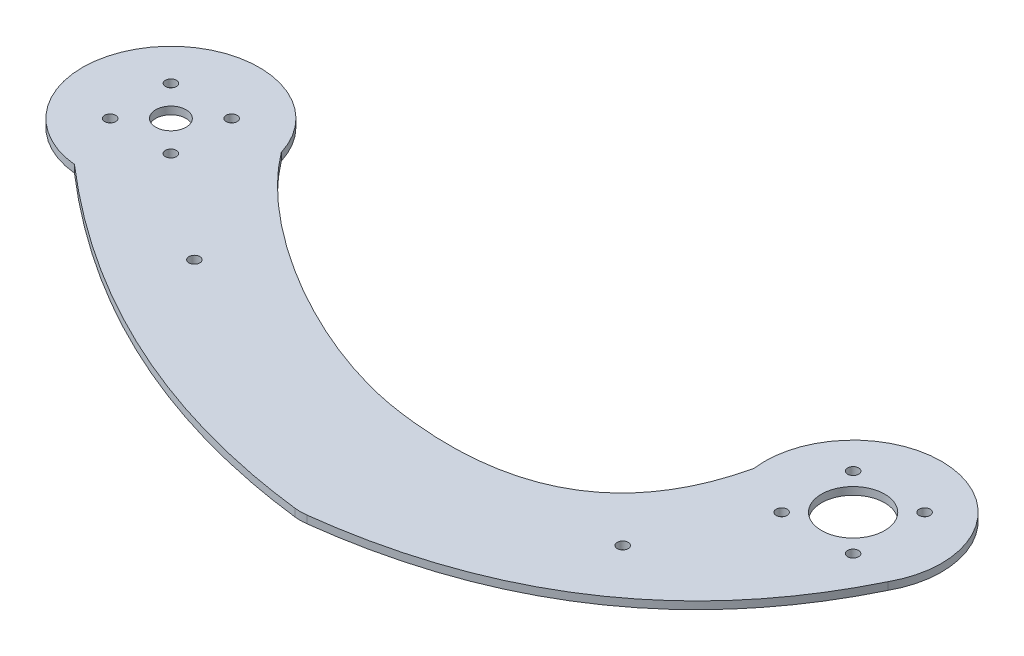
ISO-10303-21;
HEADER;
FILE_DESCRIPTION(('STEP AP214'),'2;1');
FILE_NAME('part.step','',(''),(''),'','','');
FILE_SCHEMA(('AUTOMOTIVE_DESIGN { 1 0 10303 214 1 1 1 1 }'));
ENDSEC;
DATA;
#1=APPLICATION_CONTEXT('core data for automotive mechanical design processes');
#2=APPLICATION_PROTOCOL_DEFINITION('international standard','automotive_design',2000,#1);
#3=PRODUCT_CONTEXT('',#1,'mechanical');
#4=PRODUCT('Part','Part','',(#3));
#5=PRODUCT_RELATED_PRODUCT_CATEGORY('part','',(#4));
#6=PRODUCT_DEFINITION_FORMATION('','',#4);
#7=PRODUCT_DEFINITION_CONTEXT('part definition',#1,'design');
#8=PRODUCT_DEFINITION('design','',#6,#7);
#9=PRODUCT_DEFINITION_SHAPE('','',#8);
#10=(LENGTH_UNIT() NAMED_UNIT(*) SI_UNIT(.MILLI.,.METRE.));
#11=(NAMED_UNIT(*) PLANE_ANGLE_UNIT() SI_UNIT($,.RADIAN.));
#12=(NAMED_UNIT(*) SI_UNIT($,.STERADIAN.) SOLID_ANGLE_UNIT());
#13=UNCERTAINTY_MEASURE_WITH_UNIT(LENGTH_MEASURE(1.E-05),#10,'distance_accuracy_value','');
#14=(GEOMETRIC_REPRESENTATION_CONTEXT(3) GLOBAL_UNCERTAINTY_ASSIGNED_CONTEXT((#13)) GLOBAL_UNIT_ASSIGNED_CONTEXT((#10,
#11,#12)) REPRESENTATION_CONTEXT('',''));
#15=CARTESIAN_POINT('',(0.,0.,0.));
#16=DIRECTION('',(0.,0.,1.));
#17=DIRECTION('',(1.,0.,0.));
#18=AXIS2_PLACEMENT_3D('',#15,#16,#17);
#19=CARTESIAN_POINT('',(-118.261066558205,1.5,-5.10471421640356));
#20=CARTESIAN_POINT('',(-107.655217460024,1.5,9.02423040156873));
#21=CARTESIAN_POINT('',(-84.0425144989486,1.5,23.6719178940767));
#22=CARTESIAN_POINT('',(-64.3720793477385,1.5,27.2877139284286));
#23=B_SPLINE_CURVE_WITH_KNOTS('',3,(#19,#20,#21,#22),.UNSPECIFIED.,.F.,.F.,(4,4),(0.,1.),.UNSPECIFIED.);
#24=DIRECTION('',(0.,-1.,0.));
#25=VECTOR('',#24,1.);
#26=SURFACE_OF_LINEAR_EXTRUSION('',#23,#25);
#27=CARTESIAN_POINT('',(-118.261066558205,0.,-5.10471421640356));
#28=CARTESIAN_POINT('',(-107.655217460024,0.,9.02423040156873));
#29=CARTESIAN_POINT('',(-84.0425144989486,0.,23.6719178940767));
#30=CARTESIAN_POINT('',(-64.3720793477385,0.,27.2877139284286));
#31=B_SPLINE_CURVE_WITH_KNOTS('',3,(#27,#28,#29,#30),.UNSPECIFIED.,.F.,.F.,(4,4),(0.,1.),.UNSPECIFIED.);
#32=CARTESIAN_POINT('',(-118.261066558205,0.,-5.10471421640356));
#33=VERTEX_POINT('',#32);
#34=CARTESIAN_POINT('',(-64.3720793477385,0.,27.2877139284286));
#35=VERTEX_POINT('',#34);
#36=EDGE_CURVE('E101',#33,#35,#31,.T.);
#37=ORIENTED_EDGE('',*,*,#36,.F.);
#38=DIRECTION('',(0.,-1.,0.));
#39=VECTOR('',#38,1.);
#40=CARTESIAN_POINT('',(-118.261066558205,1.5,-5.10471421640356));
#41=LINE('',#40,#39);
#42=CARTESIAN_POINT('',(-118.261066558205,1.5,-5.10471421640356));
#43=VERTEX_POINT('',#42);
#44=EDGE_CURVE('E96',#43,#33,#41,.T.);
#45=ORIENTED_EDGE('',*,*,#44,.F.);
#46=CARTESIAN_POINT('',(-64.3720793477385,1.5,27.2877139284286));
#47=VERTEX_POINT('',#46);
#48=EDGE_CURVE('E99',#43,#47,#23,.T.);
#49=ORIENTED_EDGE('',*,*,#48,.T.);
#50=DIRECTION('',(0.,-1.,0.));
#51=VECTOR('',#50,1.);
#52=CARTESIAN_POINT('',(-64.3720793477385,1.5,27.2877139284286));
#53=LINE('',#52,#51);
#54=EDGE_CURVE('E203',#47,#35,#53,.T.);
#55=ORIENTED_EDGE('',*,*,#54,.T.);
#56=EDGE_LOOP('',(#37,#45,#49,#55));
#57=FACE_BOUND('',#56,.T.);
#58=ADVANCED_FACE('F35',(#57),#26,.T.);
#59=CARTESIAN_POINT('',(-135.,1.5,0.));
#60=DIRECTION('',(0.,-1.,0.));
#61=DIRECTION('',(0.,0.,-1.));
#62=AXIS2_PLACEMENT_3D('',#59,#60,#61);
#63=CYLINDRICAL_SURFACE('',#62,17.5);
#64=CARTESIAN_POINT('',(-135.,0.,0.));
#65=DIRECTION('',(0.,1.,0.));
#66=DIRECTION('',(0.,0.,1.));
#67=AXIS2_PLACEMENT_3D('',#64,#65,#66);
#68=CIRCLE('',#67,17.5);
#69=CARTESIAN_POINT('',(-136.664707238582,0.,17.4206414867482));
#70=VERTEX_POINT('',#69);
#71=EDGE_CURVE('E252',#33,#70,#68,.T.);
#72=ORIENTED_EDGE('',*,*,#71,.T.);
#73=DIRECTION('',(0.,-1.,0.));
#74=VECTOR('',#73,1.);
#75=CARTESIAN_POINT('',(-136.664707238582,1.5,17.4206414867482));
#76=LINE('',#75,#74);
#77=CARTESIAN_POINT('',(-136.664707238582,1.5,17.4206414867482));
#78=VERTEX_POINT('',#77);
#79=EDGE_CURVE('E105',#78,#70,#76,.T.);
#80=ORIENTED_EDGE('',*,*,#79,.F.);
#81=CARTESIAN_POINT('',(-135.,1.5,0.));
#82=DIRECTION('',(0.,1.,0.));
#83=DIRECTION('',(0.,0.,1.));
#84=AXIS2_PLACEMENT_3D('',#81,#82,#83);
#85=CIRCLE('',#84,17.5);
#86=EDGE_CURVE('E108',#43,#78,#85,.T.);
#87=ORIENTED_EDGE('',*,*,#86,.F.);
#88=ORIENTED_EDGE('',*,*,#44,.T.);
#89=EDGE_LOOP('',(#72,#80,#87,#88));
#90=FACE_BOUND('',#89,.T.);
#91=ADVANCED_FACE('F109',(#90),#63,.T.);
#92=CARTESIAN_POINT('',(-136.664707238582,1.5,17.4206414867482));
#93=CARTESIAN_POINT('',(-99.4930209229655,1.5,49.665084924322));
#94=CARTESIAN_POINT('',(-54.7701998799787,1.5,54.651995586945));
#95=B_SPLINE_CURVE_WITH_KNOTS('',2,(#92,#93,#94),.UNSPECIFIED.,.F.,.F.,(3,3),(0.,1.),.UNSPECIFIED.);
#96=DIRECTION('',(0.,-1.,0.));
#97=VECTOR('',#96,1.);
#98=SURFACE_OF_LINEAR_EXTRUSION('',#95,#97);
#99=CARTESIAN_POINT('',(-136.664707238582,0.,17.4206414867482));
#100=CARTESIAN_POINT('',(-99.4930209229655,0.,49.665084924322));
#101=CARTESIAN_POINT('',(-54.7701998799787,0.,54.651995586945));
#102=B_SPLINE_CURVE_WITH_KNOTS('',2,(#99,#100,#101),.UNSPECIFIED.,.F.,.F.,(3,3),(0.,1.),.UNSPECIFIED.);
#103=CARTESIAN_POINT('',(-55.9740190021661,0.,54.5126598167099));
#104=VERTEX_POINT('',#103);
#105=EDGE_CURVE('E372',#70,#104,#102,.T.);
#106=ORIENTED_EDGE('',*,*,#105,.T.);
#107=DIRECTION('',(0.,-1.,0.));
#108=VECTOR('',#107,1.);
#109=CARTESIAN_POINT('',(-55.9740190021661,0.,54.5126598167099));
#110=LINE('',#109,#108);
#111=CARTESIAN_POINT('',(-55.9740190021661,1.5,54.5126598167099));
#112=VERTEX_POINT('',#111);
#113=EDGE_CURVE('E44',#104,#112,#110,.F.);
#114=ORIENTED_EDGE('',*,*,#113,.T.);
#115=EDGE_CURVE('E112',#78,#112,#95,.T.);
#116=ORIENTED_EDGE('',*,*,#115,.F.);
#117=ORIENTED_EDGE('',*,*,#79,.T.);
#118=EDGE_LOOP('',(#106,#114,#116,#117));
#119=FACE_BOUND('',#118,.T.);
#120=ADVANCED_FACE('F138',(#119),#98,.F.);
#121=CARTESIAN_POINT('',(15.3309677425393,1.5,8.43868639524062));
#122=CARTESIAN_POINT('',(-4.32865670175105,1.5,48.9170653982276));
#123=CARTESIAN_POINT('',(-54.7701998799787,1.5,54.651995586945));
#124=B_SPLINE_CURVE_WITH_KNOTS('',2,(#121,#122,#123),.UNSPECIFIED.,.F.,.F.,(3,3),(0.,1.),.UNSPECIFIED.);
#125=DIRECTION('',(0.,-1.,0.));
#126=VECTOR('',#125,1.);
#127=SURFACE_OF_LINEAR_EXTRUSION('',#124,#126);
#128=CARTESIAN_POINT('',(15.3309677425393,1.5,8.43868639524061));
#129=VERTEX_POINT('',#128);
#130=CARTESIAN_POINT('',(-53.5631487986116,1.5,54.509245270254));
#131=VERTEX_POINT('',#130);
#132=EDGE_CURVE('E147',#129,#131,#124,.T.);
#133=ORIENTED_EDGE('',*,*,#132,.T.);
#134=DIRECTION('',(0.,-1.,0.));
#135=VECTOR('',#134,1.);
#136=CARTESIAN_POINT('',(-53.5631487986116,1.5,54.509245270254));
#137=LINE('',#136,#135);
#138=CARTESIAN_POINT('',(-53.5631487986116,0.,54.509245270254));
#139=VERTEX_POINT('',#138);
#140=EDGE_CURVE('E104',#131,#139,#137,.T.);
#141=ORIENTED_EDGE('',*,*,#140,.T.);
#142=CARTESIAN_POINT('',(15.3309677425393,0.,8.43868639524062));
#143=CARTESIAN_POINT('',(-4.32865670175105,0.,48.9170653982276));
#144=CARTESIAN_POINT('',(-54.7701998799787,0.,54.651995586945));
#145=B_SPLINE_CURVE_WITH_KNOTS('',2,(#142,#143,#144),.UNSPECIFIED.,.F.,.F.,(3,3),(0.,1.),.UNSPECIFIED.);
#146=CARTESIAN_POINT('',(15.3309677425393,0.,8.43868639524061));
#147=VERTEX_POINT('',#146);
#148=EDGE_CURVE('E200',#147,#139,#145,.T.);
#149=ORIENTED_EDGE('',*,*,#148,.F.);
#150=DIRECTION('',(0.,-1.,0.));
#151=VECTOR('',#150,1.);
#152=CARTESIAN_POINT('',(15.3309677425393,1.5,8.43868639524061));
#153=LINE('',#152,#151);
#154=EDGE_CURVE('E196',#129,#147,#153,.T.);
#155=ORIENTED_EDGE('',*,*,#154,.F.);
#156=EDGE_LOOP('',(#133,#141,#149,#155));
#157=FACE_BOUND('',#156,.T.);
#158=ADVANCED_FACE('F141',(#157),#127,.T.);
#159=CARTESIAN_POINT('',(0.,1.5,0.));
#160=DIRECTION('',(0.,-1.,0.));
#161=DIRECTION('',(0.,0.,-1.));
#162=AXIS2_PLACEMENT_3D('',#159,#160,#161);
#163=CYLINDRICAL_SURFACE('',#162,17.5);
#164=CARTESIAN_POINT('',(0.,0.,0.));
#165=DIRECTION('',(0.,1.,0.));
#166=DIRECTION('',(0.,0.,1.));
#167=AXIS2_PLACEMENT_3D('',#164,#165,#166);
#168=CIRCLE('',#167,17.5);
#169=CARTESIAN_POINT('',(-17.3457531586902,0.,2.3183717039741));
#170=VERTEX_POINT('',#169);
#171=EDGE_CURVE('E192',#147,#170,#168,.T.);
#172=ORIENTED_EDGE('',*,*,#171,.T.);
#173=DIRECTION('',(0.,-1.,0.));
#174=VECTOR('',#173,1.);
#175=CARTESIAN_POINT('',(-17.3457531586902,1.5,2.3183717039741));
#176=LINE('',#175,#174);
#177=CARTESIAN_POINT('',(-17.3457531586902,1.5,2.3183717039741));
#178=VERTEX_POINT('',#177);
#179=EDGE_CURVE('E195',#178,#170,#176,.T.);
#180=ORIENTED_EDGE('',*,*,#179,.F.);
#181=CARTESIAN_POINT('',(0.,1.5,0.));
#182=DIRECTION('',(0.,1.,0.));
#183=DIRECTION('',(0.,0.,1.));
#184=AXIS2_PLACEMENT_3D('',#181,#182,#183);
#185=CIRCLE('',#184,17.5);
#186=EDGE_CURVE('E156',#129,#178,#185,.T.);
#187=ORIENTED_EDGE('',*,*,#186,.F.);
#188=ORIENTED_EDGE('',*,*,#154,.T.);
#189=EDGE_LOOP('',(#172,#180,#187,#188));
#190=FACE_BOUND('',#189,.T.);
#191=ADVANCED_FACE('F178',(#190),#163,.T.);
#192=CARTESIAN_POINT('',(-141.010407640085,1.5,6.01040764008586));
#193=DIRECTION('',(0.,-1.,0.));
#194=DIRECTION('',(0.,0.,-1.));
#195=AXIS2_PLACEMENT_3D('',#192,#193,#194);
#196=CYLINDRICAL_SURFACE('',#195,1.09000000000001);
#197=CARTESIAN_POINT('',(-141.010407640085,1.5,6.01040764008586));
#198=DIRECTION('',(0.,1.,0.));
#199=DIRECTION('',(0.,0.,1.));
#200=AXIS2_PLACEMENT_3D('',#197,#198,#199);
#201=CIRCLE('',#200,1.09000000000001);
#202=CARTESIAN_POINT('',(-141.010407640085,1.5,7.10040764008587));
#203=VERTEX_POINT('',#202);
#204=EDGE_CURVE('E361',#203,#203,#201,.T.);
#205=ORIENTED_EDGE('',*,*,#204,.T.);
#206=EDGE_LOOP('',(#205));
#207=FACE_BOUND('',#206,.T.);
#208=CARTESIAN_POINT('',(-141.010407640085,0.,6.01040764008586));
#209=DIRECTION('',(0.,1.,0.));
#210=DIRECTION('',(0.,0.,1.));
#211=AXIS2_PLACEMENT_3D('',#208,#209,#210);
#212=CIRCLE('',#211,1.09000000000001);
#213=CARTESIAN_POINT('',(-141.010407640085,0.,7.10040764008587));
#214=VERTEX_POINT('',#213);
#215=EDGE_CURVE('E122',#214,#214,#212,.T.);
#216=ORIENTED_EDGE('',*,*,#215,.F.);
#217=EDGE_LOOP('',(#216));
#218=FACE_BOUND('',#217,.T.);
#219=ADVANCED_FACE('F180',(#207,#218),#196,.F.);
#220=CARTESIAN_POINT('',(-128.989592359914,1.5,6.01040764008565));
#221=DIRECTION('',(0.,-1.,0.));
#222=DIRECTION('',(0.,0.,-1.));
#223=AXIS2_PLACEMENT_3D('',#220,#221,#222);
#224=CYLINDRICAL_SURFACE('',#223,1.09000000000001);
#225=CARTESIAN_POINT('',(-128.989592359914,1.5,6.01040764008565));
#226=DIRECTION('',(0.,1.,0.));
#227=DIRECTION('',(0.,0.,1.));
#228=AXIS2_PLACEMENT_3D('',#225,#226,#227);
#229=CIRCLE('',#228,1.09000000000001);
#230=CARTESIAN_POINT('',(-128.989592359914,1.5,7.10040764008566));
#231=VERTEX_POINT('',#230);
#232=EDGE_CURVE('E358',#231,#231,#229,.T.);
#233=ORIENTED_EDGE('',*,*,#232,.T.);
#234=EDGE_LOOP('',(#233));
#235=FACE_BOUND('',#234,.T.);
#236=CARTESIAN_POINT('',(-128.989592359914,0.,6.01040764008565));
#237=DIRECTION('',(0.,1.,0.));
#238=DIRECTION('',(0.,0.,1.));
#239=AXIS2_PLACEMENT_3D('',#236,#237,#238);
#240=CIRCLE('',#239,1.09000000000001);
#241=CARTESIAN_POINT('',(-128.989592359914,0.,7.10040764008566));
#242=VERTEX_POINT('',#241);
#243=EDGE_CURVE('E236',#242,#242,#240,.T.);
#244=ORIENTED_EDGE('',*,*,#243,.F.);
#245=EDGE_LOOP('',(#244));
#246=FACE_BOUND('',#245,.T.);
#247=ADVANCED_FACE('F186',(#235,#246),#224,.F.);
#248=CARTESIAN_POINT('',(-128.989592359914,1.5,-6.01040764008566));
#249=DIRECTION('',(0.,-1.,0.));
#250=DIRECTION('',(0.,0.,-1.));
#251=AXIS2_PLACEMENT_3D('',#248,#249,#250);
#252=CYLINDRICAL_SURFACE('',#251,1.09000000000001);
#253=CARTESIAN_POINT('',(-128.989592359914,1.5,-6.01040764008566));
#254=DIRECTION('',(0.,1.,0.));
#255=DIRECTION('',(0.,0.,1.));
#256=AXIS2_PLACEMENT_3D('',#253,#254,#255);
#257=CIRCLE('',#256,1.09000000000001);
#258=CARTESIAN_POINT('',(-128.989592359914,1.5,-4.92040764008565));
#259=VERTEX_POINT('',#258);
#260=EDGE_CURVE('E355',#259,#259,#257,.T.);
#261=ORIENTED_EDGE('',*,*,#260,.T.);
#262=EDGE_LOOP('',(#261));
#263=FACE_BOUND('',#262,.T.);
#264=CARTESIAN_POINT('',(-128.989592359914,0.,-6.01040764008566));
#265=DIRECTION('',(0.,1.,0.));
#266=DIRECTION('',(0.,0.,1.));
#267=AXIS2_PLACEMENT_3D('',#264,#265,#266);
#268=CIRCLE('',#267,1.09000000000001);
#269=CARTESIAN_POINT('',(-128.989592359914,0.,-4.92040764008565));
#270=VERTEX_POINT('',#269);
#271=EDGE_CURVE('E233',#270,#270,#268,.T.);
#272=ORIENTED_EDGE('',*,*,#271,.F.);
#273=EDGE_LOOP('',(#272));
#274=FACE_BOUND('',#273,.T.);
#275=ADVANCED_FACE('F283',(#263,#274),#252,.F.);
#276=CARTESIAN_POINT('',(-7.07106781186506,1.5,7.07106781186553));
#277=DIRECTION('',(0.,-1.,0.));
#278=DIRECTION('',(0.,0.,-1.));
#279=AXIS2_PLACEMENT_3D('',#276,#277,#278);
#280=CYLINDRICAL_SURFACE('',#279,1.08999999999994);
#281=CARTESIAN_POINT('',(-7.07106781186506,1.5,7.07106781186553));
#282=DIRECTION('',(0.,1.,0.));
#283=DIRECTION('',(0.,0.,1.));
#284=AXIS2_PLACEMENT_3D('',#281,#282,#283);
#285=CIRCLE('',#284,1.08999999999994);
#286=CARTESIAN_POINT('',(-7.07106781186506,1.5,8.16106781186548));
#287=VERTEX_POINT('',#286);
#288=EDGE_CURVE('E352',#287,#287,#285,.T.);
#289=ORIENTED_EDGE('',*,*,#288,.T.);
#290=EDGE_LOOP('',(#289));
#291=FACE_BOUND('',#290,.T.);
#292=CARTESIAN_POINT('',(-7.07106781186506,0.,7.07106781186553));
#293=DIRECTION('',(0.,1.,0.));
#294=DIRECTION('',(0.,0.,1.));
#295=AXIS2_PLACEMENT_3D('',#292,#293,#294);
#296=CIRCLE('',#295,1.08999999999994);
#297=CARTESIAN_POINT('',(-7.07106781186506,0.,8.16106781186548));
#298=VERTEX_POINT('',#297);
#299=EDGE_CURVE('E230',#298,#298,#296,.T.);
#300=ORIENTED_EDGE('',*,*,#299,.F.);
#301=EDGE_LOOP('',(#300));
#302=FACE_BOUND('',#301,.T.);
#303=ADVANCED_FACE('F287',(#291,#302),#280,.F.);
#304=CARTESIAN_POINT('',(7.07106781186594,1.5,7.07106781186507));
#305=DIRECTION('',(0.,-1.,0.));
#306=DIRECTION('',(0.,0.,-1.));
#307=AXIS2_PLACEMENT_3D('',#304,#305,#306);
#308=CYLINDRICAL_SURFACE('',#307,1.08999999999994);
#309=CARTESIAN_POINT('',(7.07106781186594,1.5,7.07106781186507));
#310=DIRECTION('',(0.,1.,0.));
#311=DIRECTION('',(0.,0.,1.));
#312=AXIS2_PLACEMENT_3D('',#309,#310,#311);
#313=CIRCLE('',#312,1.08999999999994);
#314=CARTESIAN_POINT('',(7.07106781186594,1.5,8.16106781186501));
#315=VERTEX_POINT('',#314);
#316=EDGE_CURVE('E349',#315,#315,#313,.T.);
#317=ORIENTED_EDGE('',*,*,#316,.T.);
#318=EDGE_LOOP('',(#317));
#319=FACE_BOUND('',#318,.T.);
#320=CARTESIAN_POINT('',(7.07106781186594,0.,7.07106781186507));
#321=DIRECTION('',(0.,1.,0.));
#322=DIRECTION('',(0.,0.,1.));
#323=AXIS2_PLACEMENT_3D('',#320,#321,#322);
#324=CIRCLE('',#323,1.08999999999994);
#325=CARTESIAN_POINT('',(7.07106781186594,0.,8.16106781186501));
#326=VERTEX_POINT('',#325);
#327=EDGE_CURVE('E227',#326,#326,#324,.T.);
#328=ORIENTED_EDGE('',*,*,#327,.F.);
#329=EDGE_LOOP('',(#328));
#330=FACE_BOUND('',#329,.T.);
#331=ADVANCED_FACE('F291',(#319,#330),#308,.F.);
#332=CARTESIAN_POINT('',(7.07106781186548,1.5,-7.07106781186592));
#333=DIRECTION('',(0.,-1.,0.));
#334=DIRECTION('',(0.,0.,-1.));
#335=AXIS2_PLACEMENT_3D('',#332,#333,#334);
#336=CYLINDRICAL_SURFACE('',#335,1.08999999999994);
#337=CARTESIAN_POINT('',(7.07106781186548,1.5,-7.07106781186592));
#338=DIRECTION('',(0.,1.,0.));
#339=DIRECTION('',(0.,0.,1.));
#340=AXIS2_PLACEMENT_3D('',#337,#338,#339);
#341=CIRCLE('',#340,1.08999999999994);
#342=CARTESIAN_POINT('',(7.07106781186548,1.5,-5.98106781186598));
#343=VERTEX_POINT('',#342);
#344=EDGE_CURVE('E343',#343,#343,#341,.T.);
#345=ORIENTED_EDGE('',*,*,#344,.T.);
#346=EDGE_LOOP('',(#345));
#347=FACE_BOUND('',#346,.T.);
#348=CARTESIAN_POINT('',(7.07106781186548,0.,-7.07106781186592));
#349=DIRECTION('',(0.,1.,0.));
#350=DIRECTION('',(0.,0.,1.));
#351=AXIS2_PLACEMENT_3D('',#348,#349,#350);
#352=CIRCLE('',#351,1.08999999999994);
#353=CARTESIAN_POINT('',(7.07106781186548,0.,-5.98106781186598));
#354=VERTEX_POINT('',#353);
#355=EDGE_CURVE('E224',#354,#354,#352,.T.);
#356=ORIENTED_EDGE('',*,*,#355,.F.);
#357=EDGE_LOOP('',(#356));
#358=FACE_BOUND('',#357,.T.);
#359=ADVANCED_FACE('F295',(#347,#358),#336,.F.);
#360=CARTESIAN_POINT('',(-135.,1.5,0.));
#361=DIRECTION('',(0.,-1.,0.));
#362=DIRECTION('',(0.,0.,-1.));
#363=AXIS2_PLACEMENT_3D('',#360,#361,#362);
#364=CYLINDRICAL_SURFACE('',#363,2.99999999999999);
#365=CARTESIAN_POINT('',(-135.,1.5,0.));
#366=DIRECTION('',(0.,1.,0.));
#367=DIRECTION('',(0.,0.,1.));
#368=AXIS2_PLACEMENT_3D('',#365,#366,#367);
#369=CIRCLE('',#368,2.99999999999999);
#370=CARTESIAN_POINT('',(-135.,1.5,2.99999999999999));
#371=VERTEX_POINT('',#370);
#372=EDGE_CURVE('E341',#371,#371,#369,.T.);
#373=ORIENTED_EDGE('',*,*,#372,.T.);
#374=EDGE_LOOP('',(#373));
#375=FACE_BOUND('',#374,.T.);
#376=CARTESIAN_POINT('',(-135.,0.,0.));
#377=DIRECTION('',(0.,1.,0.));
#378=DIRECTION('',(0.,0.,1.));
#379=AXIS2_PLACEMENT_3D('',#376,#377,#378);
#380=CIRCLE('',#379,2.99999999999999);
#381=CARTESIAN_POINT('',(-135.,0.,2.99999999999999));
#382=VERTEX_POINT('',#381);
#383=EDGE_CURVE('E221',#382,#382,#380,.T.);
#384=ORIENTED_EDGE('',*,*,#383,.F.);
#385=EDGE_LOOP('',(#384));
#386=FACE_BOUND('',#385,.T.);
#387=ADVANCED_FACE('F299',(#375,#386),#364,.F.);
#388=CARTESIAN_POINT('',(-7.07106781186552,1.5,-7.07106781186546));
#389=DIRECTION('',(0.,-1.,0.));
#390=DIRECTION('',(0.,0.,-1.));
#391=AXIS2_PLACEMENT_3D('',#388,#389,#390);
#392=CYLINDRICAL_SURFACE('',#391,1.08999999999994);
#393=CARTESIAN_POINT('',(-7.07106781186552,1.5,-7.07106781186546));
#394=DIRECTION('',(0.,1.,0.));
#395=DIRECTION('',(0.,0.,1.));
#396=AXIS2_PLACEMENT_3D('',#393,#394,#395);
#397=CIRCLE('',#396,1.08999999999994);
#398=CARTESIAN_POINT('',(-7.07106781186552,1.5,-5.98106781186552));
#399=VERTEX_POINT('',#398);
#400=EDGE_CURVE('E313',#399,#399,#397,.T.);
#401=ORIENTED_EDGE('',*,*,#400,.T.);
#402=EDGE_LOOP('',(#401));
#403=FACE_BOUND('',#402,.T.);
#404=CARTESIAN_POINT('',(-7.07106781186552,0.,-7.07106781186546));
#405=DIRECTION('',(0.,1.,0.));
#406=DIRECTION('',(0.,0.,1.));
#407=AXIS2_PLACEMENT_3D('',#404,#405,#406);
#408=CIRCLE('',#407,1.08999999999994);
#409=CARTESIAN_POINT('',(-7.07106781186552,0.,-5.98106781186552));
#410=VERTEX_POINT('',#409);
#411=EDGE_CURVE('E210',#410,#410,#408,.T.);
#412=ORIENTED_EDGE('',*,*,#411,.F.);
#413=EDGE_LOOP('',(#412));
#414=FACE_BOUND('',#413,.T.);
#415=ADVANCED_FACE('F302',(#403,#414),#392,.F.);
#416=CARTESIAN_POINT('',(0.,1.5,0.));
#417=DIRECTION('',(0.,-1.,0.));
#418=DIRECTION('',(0.,0.,-1.));
#419=AXIS2_PLACEMENT_3D('',#416,#417,#418);
#420=CYLINDRICAL_SURFACE('',#419,6.25);
#421=CARTESIAN_POINT('',(0.,1.5,0.));
#422=DIRECTION('',(0.,1.,0.));
#423=DIRECTION('',(0.,0.,1.));
#424=AXIS2_PLACEMENT_3D('',#421,#422,#423);
#425=CIRCLE('',#424,6.25);
#426=CARTESIAN_POINT('',(0.,1.5,6.25));
#427=VERTEX_POINT('',#426);
#428=EDGE_CURVE('E165',#427,#427,#425,.T.);
#429=ORIENTED_EDGE('',*,*,#428,.T.);
#430=EDGE_LOOP('',(#429));
#431=FACE_BOUND('',#430,.T.);
#432=CARTESIAN_POINT('',(0.,0.,0.));
#433=DIRECTION('',(0.,1.,0.));
#434=DIRECTION('',(0.,0.,1.));
#435=AXIS2_PLACEMENT_3D('',#432,#433,#434);
#436=CIRCLE('',#435,6.25);
#437=CARTESIAN_POINT('',(0.,0.,6.25));
#438=VERTEX_POINT('',#437);
#439=EDGE_CURVE('E207',#438,#438,#436,.T.);
#440=ORIENTED_EDGE('',*,*,#439,.F.);
#441=EDGE_LOOP('',(#440));
#442=FACE_BOUND('',#441,.T.);
#443=ADVANCED_FACE('F175',(#431,#442),#420,.F.);
#444=CARTESIAN_POINT('',(-17.3457531586902,1.5,2.31837170397411));
#445=CARTESIAN_POINT('',(-24.5723084698087,1.5,34.0047551886091));
#446=CARTESIAN_POINT('',(-64.3720793477385,1.5,27.2877139284286));
#447=B_SPLINE_CURVE_WITH_KNOTS('',2,(#444,#445,#446),.UNSPECIFIED.,.F.,.F.,(3,3),(0.,1.),.UNSPECIFIED.);
#448=DIRECTION('',(0.,-1.,0.));
#449=VECTOR('',#448,1.);
#450=SURFACE_OF_LINEAR_EXTRUSION('',#447,#449);
#451=CARTESIAN_POINT('',(-17.3457531586902,0.,2.31837170397411));
#452=CARTESIAN_POINT('',(-24.5723084698087,0.,34.0047551886091));
#453=CARTESIAN_POINT('',(-64.3720793477385,0.,27.2877139284286));
#454=B_SPLINE_CURVE_WITH_KNOTS('',2,(#451,#452,#453),.UNSPECIFIED.,.F.,.F.,(3,3),(0.,1.),.UNSPECIFIED.);
#455=EDGE_CURVE('E199',#170,#35,#454,.T.);
#456=ORIENTED_EDGE('',*,*,#455,.T.);
#457=ORIENTED_EDGE('',*,*,#54,.F.);
#458=EDGE_CURVE('E117',#178,#47,#447,.T.);
#459=ORIENTED_EDGE('',*,*,#458,.F.);
#460=ORIENTED_EDGE('',*,*,#179,.T.);
#461=EDGE_LOOP('',(#456,#457,#459,#460));
#462=FACE_BOUND('',#461,.T.);
#463=ADVANCED_FACE('F171',(#462),#450,.F.);
#464=CARTESIAN_POINT('',(-141.010407640086,1.5,-6.01040764008545));
#465=DIRECTION('',(0.,-1.,0.));
#466=DIRECTION('',(0.,0.,-1.));
#467=AXIS2_PLACEMENT_3D('',#464,#465,#466);
#468=CYLINDRICAL_SURFACE('',#467,1.09000000000001);
#469=CARTESIAN_POINT('',(-141.010407640086,1.5,-6.01040764008545));
#470=DIRECTION('',(0.,1.,0.));
#471=DIRECTION('',(0.,0.,1.));
#472=AXIS2_PLACEMENT_3D('',#469,#470,#471);
#473=CIRCLE('',#472,1.09000000000001);
#474=CARTESIAN_POINT('',(-141.010407640086,1.5,-4.92040764008544));
#475=VERTEX_POINT('',#474);
#476=EDGE_CURVE('E241',#475,#475,#473,.T.);
#477=ORIENTED_EDGE('',*,*,#476,.T.);
#478=EDGE_LOOP('',(#477));
#479=FACE_BOUND('',#478,.T.);
#480=CARTESIAN_POINT('',(-141.010407640086,0.,-6.01040764008545));
#481=DIRECTION('',(0.,1.,0.));
#482=DIRECTION('',(0.,0.,1.));
#483=AXIS2_PLACEMENT_3D('',#480,#481,#482);
#484=CIRCLE('',#483,1.09000000000001);
#485=CARTESIAN_POINT('',(-141.010407640086,0.,-4.92040764008544));
#486=VERTEX_POINT('',#485);
#487=EDGE_CURVE('E119',#486,#486,#484,.T.);
#488=ORIENTED_EDGE('',*,*,#487,.F.);
#489=EDGE_LOOP('',(#488));
#490=FACE_BOUND('',#489,.T.);
#491=ADVANCED_FACE('F174',(#479,#490),#468,.F.);
#492=CARTESIAN_POINT('',(0.,1.5,0.));
#493=DIRECTION('',(0.,1.,0.));
#494=DIRECTION('',(0.,0.,1.));
#495=AXIS2_PLACEMENT_3D('',#492,#493,#494);
#496=PLANE('',#495);
#497=CARTESIAN_POINT('',(-17.1163473303239,1.5,28.4752050369573));
#498=DIRECTION('',(0.,1.,0.));
#499=DIRECTION('',(0.,0.,1.));
#500=AXIS2_PLACEMENT_3D('',#497,#498,#499);
#501=CIRCLE('',#500,1.09);
#502=CARTESIAN_POINT('',(-17.1163473303239,1.5,29.5652050369573));
#503=VERTEX_POINT('',#502);
#504=EDGE_CURVE('E258',#503,#503,#501,.T.);
#505=ORIENTED_EDGE('',*,*,#504,.F.);
#506=EDGE_LOOP('',(#505));
#507=FACE_BOUND('',#506,.T.);
#508=CARTESIAN_POINT('',(-108.46183911208,1.5,21.8918096852696));
#509=DIRECTION('',(0.,1.,0.));
#510=DIRECTION('',(0.,0.,1.));
#511=AXIS2_PLACEMENT_3D('',#508,#509,#510);
#512=CIRCLE('',#511,1.09);
#513=CARTESIAN_POINT('',(-108.46183911208,1.5,22.9818096852696));
#514=VERTEX_POINT('',#513);
#515=EDGE_CURVE('E128',#514,#514,#512,.T.);
#516=ORIENTED_EDGE('',*,*,#515,.F.);
#517=EDGE_LOOP('',(#516));
#518=FACE_BOUND('',#517,.T.);
#519=ORIENTED_EDGE('',*,*,#115,.T.);
#520=CARTESIAN_POINT('',(-54.7826437377088,1.5,44.5838821991359));
#521=DIRECTION('',(0.,1.,0.));
#522=DIRECTION('',(0.,0.,1.));
#523=AXIS2_PLACEMENT_3D('',#520,#521,#522);
#524=CIRCLE('',#523,10.);
#525=EDGE_CURVE('E11',#112,#131,#524,.T.);
#526=ORIENTED_EDGE('',*,*,#525,.T.);
#527=ORIENTED_EDGE('',*,*,#132,.F.);
#528=ORIENTED_EDGE('',*,*,#186,.T.);
#529=ORIENTED_EDGE('',*,*,#458,.T.);
#530=ORIENTED_EDGE('',*,*,#48,.F.);
#531=ORIENTED_EDGE('',*,*,#86,.T.);
#532=EDGE_LOOP('',(#519,#526,#527,#528,#529,#530,#531));
#533=FACE_BOUND('',#532,.T.);
#534=ORIENTED_EDGE('',*,*,#428,.F.);
#535=EDGE_LOOP('',(#534));
#536=FACE_BOUND('',#535,.T.);
#537=ORIENTED_EDGE('',*,*,#400,.F.);
#538=EDGE_LOOP('',(#537));
#539=FACE_BOUND('',#538,.T.);
#540=ORIENTED_EDGE('',*,*,#372,.F.);
#541=EDGE_LOOP('',(#540));
#542=FACE_BOUND('',#541,.T.);
#543=ORIENTED_EDGE('',*,*,#344,.F.);
#544=EDGE_LOOP('',(#543));
#545=FACE_BOUND('',#544,.T.);
#546=ORIENTED_EDGE('',*,*,#316,.F.);
#547=EDGE_LOOP('',(#546));
#548=FACE_BOUND('',#547,.T.);
#549=ORIENTED_EDGE('',*,*,#288,.F.);
#550=EDGE_LOOP('',(#549));
#551=FACE_BOUND('',#550,.T.);
#552=ORIENTED_EDGE('',*,*,#260,.F.);
#553=EDGE_LOOP('',(#552));
#554=FACE_BOUND('',#553,.T.);
#555=ORIENTED_EDGE('',*,*,#232,.F.);
#556=EDGE_LOOP('',(#555));
#557=FACE_BOUND('',#556,.T.);
#558=ORIENTED_EDGE('',*,*,#204,.F.);
#559=EDGE_LOOP('',(#558));
#560=FACE_BOUND('',#559,.T.);
#561=ORIENTED_EDGE('',*,*,#476,.F.);
#562=EDGE_LOOP('',(#561));
#563=FACE_BOUND('',#562,.T.);
#564=ADVANCED_FACE('F114',(#507,#518,#533,#536,#539,#542,#545,#548,#551,#554,#557,#560,#563),
#496,.T.);
#565=CARTESIAN_POINT('',(0.,0.,0.));
#566=DIRECTION('',(0.,1.,0.));
#567=DIRECTION('',(0.,0.,1.));
#568=AXIS2_PLACEMENT_3D('',#565,#566,#567);
#569=PLANE('',#568);
#570=CARTESIAN_POINT('',(-17.1163473303239,0.,28.4752050369573));
#571=DIRECTION('',(0.,1.,0.));
#572=DIRECTION('',(0.,0.,1.));
#573=AXIS2_PLACEMENT_3D('',#570,#571,#572);
#574=CIRCLE('',#573,1.09);
#575=CARTESIAN_POINT('',(-17.1163473303239,0.,29.5652050369573));
#576=VERTEX_POINT('',#575);
#577=EDGE_CURVE('E39',#576,#576,#574,.T.);
#578=ORIENTED_EDGE('',*,*,#577,.T.);
#579=EDGE_LOOP('',(#578));
#580=FACE_BOUND('',#579,.T.);
#581=CARTESIAN_POINT('',(-108.46183911208,0.,21.8918096852696));
#582=DIRECTION('',(0.,1.,0.));
#583=DIRECTION('',(0.,0.,1.));
#584=AXIS2_PLACEMENT_3D('',#581,#582,#583);
#585=CIRCLE('',#584,1.09);
#586=CARTESIAN_POINT('',(-108.46183911208,0.,22.9818096852696));
#587=VERTEX_POINT('',#586);
#588=EDGE_CURVE('E248',#587,#587,#585,.T.);
#589=ORIENTED_EDGE('',*,*,#588,.T.);
#590=EDGE_LOOP('',(#589));
#591=FACE_BOUND('',#590,.T.);
#592=ORIENTED_EDGE('',*,*,#148,.T.);
#593=CARTESIAN_POINT('',(-54.7826437377088,0.,44.5838821991359));
#594=DIRECTION('',(0.,1.,0.));
#595=DIRECTION('',(0.,0.,1.));
#596=AXIS2_PLACEMENT_3D('',#593,#594,#595);
#597=CIRCLE('',#596,10.);
#598=EDGE_CURVE('E59',#139,#104,#597,.F.);
#599=ORIENTED_EDGE('',*,*,#598,.T.);
#600=ORIENTED_EDGE('',*,*,#105,.F.);
#601=ORIENTED_EDGE('',*,*,#71,.F.);
#602=ORIENTED_EDGE('',*,*,#36,.T.);
#603=ORIENTED_EDGE('',*,*,#455,.F.);
#604=ORIENTED_EDGE('',*,*,#171,.F.);
#605=EDGE_LOOP('',(#592,#599,#600,#601,#602,#603,#604));
#606=FACE_BOUND('',#605,.T.);
#607=ORIENTED_EDGE('',*,*,#439,.T.);
#608=EDGE_LOOP('',(#607));
#609=FACE_BOUND('',#608,.T.);
#610=ORIENTED_EDGE('',*,*,#411,.T.);
#611=EDGE_LOOP('',(#610));
#612=FACE_BOUND('',#611,.T.);
#613=ORIENTED_EDGE('',*,*,#383,.T.);
#614=EDGE_LOOP('',(#613));
#615=FACE_BOUND('',#614,.T.);
#616=ORIENTED_EDGE('',*,*,#355,.T.);
#617=EDGE_LOOP('',(#616));
#618=FACE_BOUND('',#617,.T.);
#619=ORIENTED_EDGE('',*,*,#327,.T.);
#620=EDGE_LOOP('',(#619));
#621=FACE_BOUND('',#620,.T.);
#622=ORIENTED_EDGE('',*,*,#299,.T.);
#623=EDGE_LOOP('',(#622));
#624=FACE_BOUND('',#623,.T.);
#625=ORIENTED_EDGE('',*,*,#271,.T.);
#626=EDGE_LOOP('',(#625));
#627=FACE_BOUND('',#626,.T.);
#628=ORIENTED_EDGE('',*,*,#243,.T.);
#629=EDGE_LOOP('',(#628));
#630=FACE_BOUND('',#629,.T.);
#631=ORIENTED_EDGE('',*,*,#215,.T.);
#632=EDGE_LOOP('',(#631));
#633=FACE_BOUND('',#632,.T.);
#634=ORIENTED_EDGE('',*,*,#487,.T.);
#635=EDGE_LOOP('',(#634));
#636=FACE_BOUND('',#635,.T.);
#637=ADVANCED_FACE('F205',(#580,#591,#606,#609,#612,#615,#618,#621,#624,#627,#630,#633,#636),
#569,.F.);
#638=CARTESIAN_POINT('',(-54.7826437377088,0.75,44.5838821991359));
#639=DIRECTION('',(0.,-1.,0.));
#640=DIRECTION('',(0.,0.,-1.));
#641=AXIS2_PLACEMENT_3D('',#638,#639,#640);
#642=CYLINDRICAL_SURFACE('',#641,10.);
#643=ORIENTED_EDGE('',*,*,#525,.F.);
#644=ORIENTED_EDGE('',*,*,#113,.F.);
#645=ORIENTED_EDGE('',*,*,#598,.F.);
#646=ORIENTED_EDGE('',*,*,#140,.F.);
#647=EDGE_LOOP('',(#643,#644,#645,#646));
#648=FACE_BOUND('',#647,.T.);
#649=ADVANCED_FACE('F37',(#648),#642,.T.);
#650=CARTESIAN_POINT('',(-108.46183911208,-8.5,21.8918096852696));
#651=DIRECTION('',(0.,1.,0.));
#652=DIRECTION('',(0.,0.,1.));
#653=AXIS2_PLACEMENT_3D('',#650,#651,#652);
#654=CYLINDRICAL_SURFACE('',#653,1.09);
#655=ORIENTED_EDGE('',*,*,#515,.T.);
#656=EDGE_LOOP('',(#655));
#657=FACE_BOUND('',#656,.T.);
#658=ORIENTED_EDGE('',*,*,#588,.F.);
#659=EDGE_LOOP('',(#658));
#660=FACE_BOUND('',#659,.T.);
#661=ADVANCED_FACE('F278',(#657,#660),#654,.F.);
#662=CARTESIAN_POINT('',(-17.1163473303239,-8.5,28.4752050369573));
#663=DIRECTION('',(0.,1.,0.));
#664=DIRECTION('',(0.,0.,1.));
#665=AXIS2_PLACEMENT_3D('',#662,#663,#664);
#666=CYLINDRICAL_SURFACE('',#665,1.09);
#667=ORIENTED_EDGE('',*,*,#504,.T.);
#668=EDGE_LOOP('',(#667));
#669=FACE_BOUND('',#668,.T.);
#670=ORIENTED_EDGE('',*,*,#577,.F.);
#671=EDGE_LOOP('',(#670));
#672=FACE_BOUND('',#671,.T.);
#673=ADVANCED_FACE('F264',(#669,#672),#666,.F.);
#674=CLOSED_SHELL('',(#58,#91,#120,#158,#191,#219,#247,#275,#303,#331,#359,#387,#415,#443,#463,
#491,#564,#637,#649,#661,#673));
#675=MANIFOLD_SOLID_BREP('B2',#674);
#676=ADVANCED_BREP_SHAPE_REPRESENTATION('',(#18,#675),#14);
#677=SHAPE_DEFINITION_REPRESENTATION(#9,#676);
ENDSEC;
END-ISO-10303-21;
